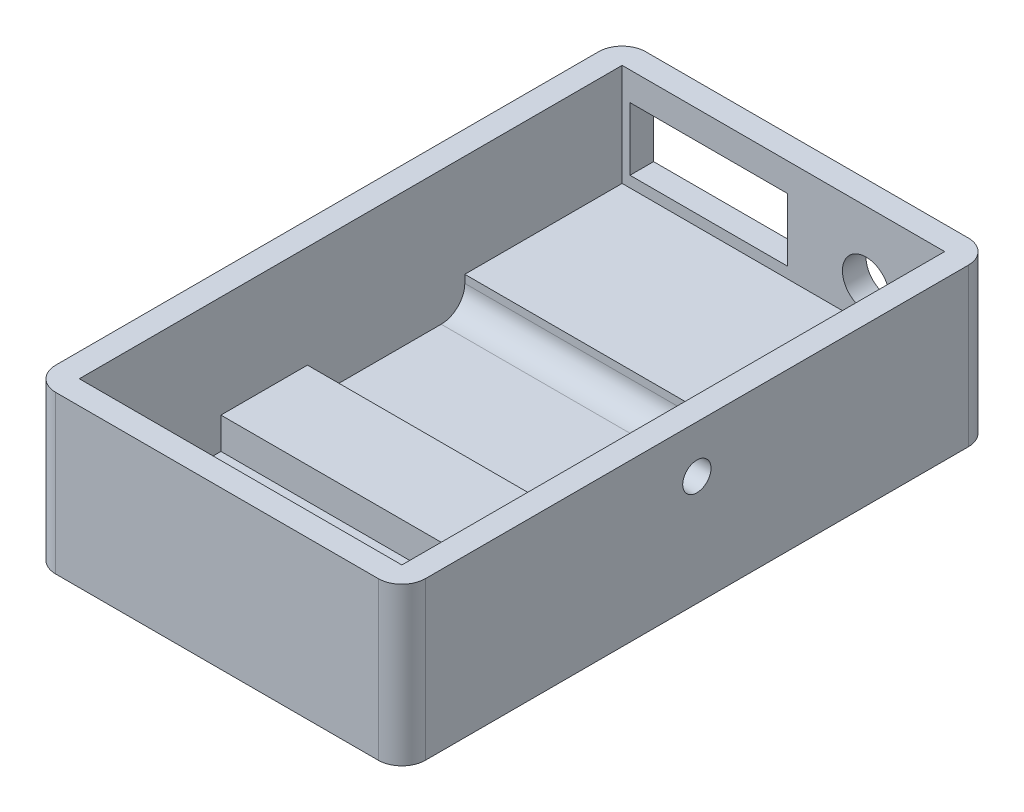
ISO-10303-21;
HEADER;
FILE_DESCRIPTION(('STEP AP214'),'2;1');
FILE_NAME('part.step','',(''),(''),'','','');
FILE_SCHEMA(('AUTOMOTIVE_DESIGN { 1 0 10303 214 1 1 1 1 }'));
ENDSEC;
DATA;
#1=APPLICATION_CONTEXT('core data for automotive mechanical design processes');
#2=APPLICATION_PROTOCOL_DEFINITION('international standard','automotive_design',2000,#1);
#3=PRODUCT_CONTEXT('',#1,'mechanical');
#4=PRODUCT('Part','Part','',(#3));
#5=PRODUCT_RELATED_PRODUCT_CATEGORY('part','',(#4));
#6=PRODUCT_DEFINITION_FORMATION('','',#4);
#7=PRODUCT_DEFINITION_CONTEXT('part definition',#1,'design');
#8=PRODUCT_DEFINITION('design','',#6,#7);
#9=PRODUCT_DEFINITION_SHAPE('','',#8);
#10=(LENGTH_UNIT() NAMED_UNIT(*) SI_UNIT(.MILLI.,.METRE.));
#11=(NAMED_UNIT(*) PLANE_ANGLE_UNIT() SI_UNIT($,.RADIAN.));
#12=(NAMED_UNIT(*) SI_UNIT($,.STERADIAN.) SOLID_ANGLE_UNIT());
#13=UNCERTAINTY_MEASURE_WITH_UNIT(LENGTH_MEASURE(1.E-05),#10,'distance_accuracy_value','');
#14=(GEOMETRIC_REPRESENTATION_CONTEXT(3) GLOBAL_UNCERTAINTY_ASSIGNED_CONTEXT((#13)) GLOBAL_UNIT_ASSIGNED_CONTEXT((#10,
#11,#12)) REPRESENTATION_CONTEXT('',''));
#15=CARTESIAN_POINT('',(0.,0.,0.));
#16=DIRECTION('',(0.,0.,1.));
#17=DIRECTION('',(1.,0.,0.));
#18=AXIS2_PLACEMENT_3D('',#15,#16,#17);
#19=CARTESIAN_POINT('',(0.,3.5,0.));
#20=DIRECTION('',(0.,1.,0.));
#21=DIRECTION('',(0.,0.,1.));
#22=AXIS2_PLACEMENT_3D('',#19,#20,#21);
#23=PLANE('',#22);
#24=CARTESIAN_POINT('',(7.85,3.5,-10.85));
#25=DIRECTION('',(0.,1.,0.));
#26=DIRECTION('',(0.,0.,1.));
#27=AXIS2_PLACEMENT_3D('',#24,#25,#26);
#28=CIRCLE('',#27,0.9);
#29=CARTESIAN_POINT('',(7.85,3.5,-9.95));
#30=VERTEX_POINT('',#29);
#31=EDGE_CURVE('E463',#30,#30,#28,.T.);
#32=ORIENTED_EDGE('',*,*,#31,.F.);
#33=EDGE_LOOP('',(#32));
#34=FACE_BOUND('',#33,.T.);
#35=DIRECTION('',(-1.,0.,0.));
#36=VECTOR('',#35,1.);
#37=CARTESIAN_POINT('',(-10.25,3.5,-7.25));
#38=LINE('',#37,#36);
#39=CARTESIAN_POINT('',(10.25,3.5,-7.25));
#40=VERTEX_POINT('',#39);
#41=CARTESIAN_POINT('',(-10.25,3.5,-7.25));
#42=VERTEX_POINT('',#41);
#43=EDGE_CURVE('E242',#40,#42,#38,.T.);
#44=ORIENTED_EDGE('',*,*,#43,.F.);
#45=DIRECTION('',(0.,0.,-1.));
#46=VECTOR('',#45,1.);
#47=CARTESIAN_POINT('',(10.25,3.5,-17.25));
#48=LINE('',#47,#46);
#49=CARTESIAN_POINT('',(10.25,3.5,-17.25));
#50=VERTEX_POINT('',#49);
#51=EDGE_CURVE('E273',#40,#50,#48,.T.);
#52=ORIENTED_EDGE('',*,*,#51,.T.);
#53=DIRECTION('',(-1.,0.,0.));
#54=VECTOR('',#53,1.);
#55=CARTESIAN_POINT('',(-10.25,3.5,-17.25));
#56=LINE('',#55,#54);
#57=CARTESIAN_POINT('',(-10.25,3.5,-17.25));
#58=VERTEX_POINT('',#57);
#59=EDGE_CURVE('E278',#50,#58,#56,.T.);
#60=ORIENTED_EDGE('',*,*,#59,.T.);
#61=DIRECTION('',(0.,0.,1.));
#62=VECTOR('',#61,1.);
#63=CARTESIAN_POINT('',(-10.25,3.5,-17.25));
#64=LINE('',#63,#62);
#65=EDGE_CURVE('E265',#58,#42,#64,.T.);
#66=ORIENTED_EDGE('',*,*,#65,.T.);
#67=EDGE_LOOP('',(#44,#52,#60,#66));
#68=FACE_BOUND('',#67,.T.);
#69=ADVANCED_FACE('F39',(#34,#68),#23,.T.);
#70=CARTESIAN_POINT('',(-10.25,10.,-18.75));
#71=DIRECTION('',(1.,0.,0.));
#72=DIRECTION('',(0.,0.,-1.));
#73=AXIS2_PLACEMENT_3D('',#70,#71,#72);
#74=PLANE('',#73);
#75=DIRECTION('',(0.,1.,0.));
#76=VECTOR('',#75,1.);
#77=CARTESIAN_POINT('',(-10.25,1.5,2.75));
#78=LINE('',#77,#76);
#79=CARTESIAN_POINT('',(-10.25,3.,2.75));
#80=VERTEX_POINT('',#79);
#81=CARTESIAN_POINT('',(-10.25,3.5,2.75));
#82=VERTEX_POINT('',#81);
#83=EDGE_CURVE('E246',#80,#82,#78,.T.);
#84=ORIENTED_EDGE('',*,*,#83,.F.);
#85=CARTESIAN_POINT('',(-10.25,3.,1.25));
#86=DIRECTION('',(1.,0.,0.));
#87=DIRECTION('',(0.,0.,-1.));
#88=AXIS2_PLACEMENT_3D('',#85,#86,#87);
#89=CIRCLE('',#88,1.5);
#90=CARTESIAN_POINT('',(-10.25,1.5,1.25));
#91=VERTEX_POINT('',#90);
#92=EDGE_CURVE('E433',#80,#91,#89,.T.);
#93=ORIENTED_EDGE('',*,*,#92,.T.);
#94=DIRECTION('',(0.,0.,1.));
#95=VECTOR('',#94,1.);
#96=CARTESIAN_POINT('',(-10.25,1.5,-7.25));
#97=LINE('',#96,#95);
#98=CARTESIAN_POINT('',(-10.25,1.5,-5.75));
#99=VERTEX_POINT('',#98);
#100=EDGE_CURVE('E237',#99,#91,#97,.T.);
#101=ORIENTED_EDGE('',*,*,#100,.F.);
#102=CARTESIAN_POINT('',(-10.25,3.,-5.75));
#103=DIRECTION('',(1.,0.,0.));
#104=DIRECTION('',(0.,0.,-1.));
#105=AXIS2_PLACEMENT_3D('',#102,#103,#104);
#106=CIRCLE('',#105,1.5);
#107=CARTESIAN_POINT('',(-10.25,3.,-7.25));
#108=VERTEX_POINT('',#107);
#109=EDGE_CURVE('E430',#99,#108,#106,.T.);
#110=ORIENTED_EDGE('',*,*,#109,.T.);
#111=DIRECTION('',(0.,1.,0.));
#112=VECTOR('',#111,1.);
#113=CARTESIAN_POINT('',(-10.25,1.5,-7.25));
#114=LINE('',#113,#112);
#115=EDGE_CURVE('E253',#108,#42,#114,.T.);
#116=ORIENTED_EDGE('',*,*,#115,.T.);
#117=ORIENTED_EDGE('',*,*,#65,.F.);
#118=DIRECTION('',(0.,-1.,0.));
#119=VECTOR('',#118,1.);
#120=CARTESIAN_POINT('',(-10.25,10.,-17.25));
#121=LINE('',#120,#119);
#122=CARTESIAN_POINT('',(-10.25,10.,-17.25));
#123=VERTEX_POINT('',#122);
#124=EDGE_CURVE('E300',#123,#58,#121,.T.);
#125=ORIENTED_EDGE('',*,*,#124,.F.);
#126=DIRECTION('',(0.,0.,1.));
#127=VECTOR('',#126,1.);
#128=CARTESIAN_POINT('',(-10.25,10.,-18.75));
#129=LINE('',#128,#127);
#130=CARTESIAN_POINT('',(-10.25,10.,17.25));
#131=VERTEX_POINT('',#130);
#132=EDGE_CURVE('E315',#123,#131,#129,.T.);
#133=ORIENTED_EDGE('',*,*,#132,.T.);
#134=DIRECTION('',(0.,-1.,0.));
#135=VECTOR('',#134,1.);
#136=CARTESIAN_POINT('',(-10.25,10.,17.25));
#137=LINE('',#136,#135);
#138=CARTESIAN_POINT('',(-10.25,1.5,17.25));
#139=VERTEX_POINT('',#138);
#140=EDGE_CURVE('E294',#131,#139,#137,.T.);
#141=ORIENTED_EDGE('',*,*,#140,.T.);
#142=DIRECTION('',(0.,0.,1.));
#143=VECTOR('',#142,1.);
#144=CARTESIAN_POINT('',(-10.25,1.5,-18.75));
#145=LINE('',#144,#143);
#146=CARTESIAN_POINT('',(-10.25,1.5,8.25));
#147=VERTEX_POINT('',#146);
#148=EDGE_CURVE('E290',#147,#139,#145,.T.);
#149=ORIENTED_EDGE('',*,*,#148,.F.);
#150=DIRECTION('',(0.,-1.,0.));
#151=VECTOR('',#150,1.);
#152=CARTESIAN_POINT('',(-10.25,3.5,8.25));
#153=LINE('',#152,#151);
#154=CARTESIAN_POINT('',(-10.25,3.5,8.25));
#155=VERTEX_POINT('',#154);
#156=EDGE_CURVE('E287',#155,#147,#153,.T.);
#157=ORIENTED_EDGE('',*,*,#156,.F.);
#158=EDGE_CURVE('E270',#82,#155,#64,.T.);
#159=ORIENTED_EDGE('',*,*,#158,.F.);
#160=EDGE_LOOP('',(#84,#93,#101,#110,#116,#117,#125,#133,#141,#149,#157,#159));
#161=FACE_BOUND('',#160,.T.);
#162=ADVANCED_FACE('F534',(#161),#74,.T.);
#163=CARTESIAN_POINT('',(10.25,10.,-18.75));
#164=DIRECTION('',(-1.,0.,0.));
#165=DIRECTION('',(0.,0.,1.));
#166=AXIS2_PLACEMENT_3D('',#163,#164,#165);
#167=PLANE('',#166);
#168=CARTESIAN_POINT('',(10.25,7.,0.));
#169=DIRECTION('',(-1.,0.,0.));
#170=DIRECTION('',(0.,0.,1.));
#171=AXIS2_PLACEMENT_3D('',#168,#169,#170);
#172=CIRCLE('',#171,0.9);
#173=CARTESIAN_POINT('',(10.25,7.,0.899999999999999));
#174=VERTEX_POINT('',#173);
#175=EDGE_CURVE('E467',#174,#174,#172,.T.);
#176=ORIENTED_EDGE('',*,*,#175,.F.);
#177=EDGE_LOOP('',(#176));
#178=FACE_BOUND('',#177,.T.);
#179=DIRECTION('',(0.,0.,-1.));
#180=VECTOR('',#179,1.);
#181=CARTESIAN_POINT('',(10.25,1.5,-7.25));
#182=LINE('',#181,#180);
#183=CARTESIAN_POINT('',(10.25,1.5,1.25));
#184=VERTEX_POINT('',#183);
#185=CARTESIAN_POINT('',(10.25,1.5,-5.75));
#186=VERTEX_POINT('',#185);
#187=EDGE_CURVE('E241',#184,#186,#182,.T.);
#188=ORIENTED_EDGE('',*,*,#187,.F.);
#189=CARTESIAN_POINT('',(10.25,3.,1.25));
#190=DIRECTION('',(-1.,0.,0.));
#191=DIRECTION('',(0.,0.,1.));
#192=AXIS2_PLACEMENT_3D('',#189,#190,#191);
#193=CIRCLE('',#192,1.5);
#194=CARTESIAN_POINT('',(10.25,3.,2.75));
#195=VERTEX_POINT('',#194);
#196=EDGE_CURVE('E424',#184,#195,#193,.T.);
#197=ORIENTED_EDGE('',*,*,#196,.T.);
#198=DIRECTION('',(0.,1.,0.));
#199=VECTOR('',#198,1.);
#200=CARTESIAN_POINT('',(10.25,1.5,2.75));
#201=LINE('',#200,#199);
#202=CARTESIAN_POINT('',(10.25,3.5,2.75));
#203=VERTEX_POINT('',#202);
#204=EDGE_CURVE('E260',#195,#203,#201,.T.);
#205=ORIENTED_EDGE('',*,*,#204,.T.);
#206=CARTESIAN_POINT('',(10.25,3.5,8.25));
#207=VERTEX_POINT('',#206);
#208=EDGE_CURVE('E274',#207,#203,#48,.T.);
#209=ORIENTED_EDGE('',*,*,#208,.F.);
#210=DIRECTION('',(0.,-1.,0.));
#211=VECTOR('',#210,1.);
#212=CARTESIAN_POINT('',(10.25,3.5,8.25));
#213=LINE('',#212,#211);
#214=CARTESIAN_POINT('',(10.25,1.5,8.25));
#215=VERTEX_POINT('',#214);
#216=EDGE_CURVE('E281',#207,#215,#213,.T.);
#217=ORIENTED_EDGE('',*,*,#216,.T.);
#218=DIRECTION('',(0.,0.,-1.));
#219=VECTOR('',#218,1.);
#220=CARTESIAN_POINT('',(10.25,1.5,-18.75));
#221=LINE('',#220,#219);
#222=CARTESIAN_POINT('',(10.25,1.5,17.25));
#223=VERTEX_POINT('',#222);
#224=EDGE_CURVE('E308',#223,#215,#221,.T.);
#225=ORIENTED_EDGE('',*,*,#224,.F.);
#226=DIRECTION('',(0.,-1.,0.));
#227=VECTOR('',#226,1.);
#228=CARTESIAN_POINT('',(10.25,10.,17.25));
#229=LINE('',#228,#227);
#230=CARTESIAN_POINT('',(10.25,10.,17.25));
#231=VERTEX_POINT('',#230);
#232=EDGE_CURVE('E299',#231,#223,#229,.T.);
#233=ORIENTED_EDGE('',*,*,#232,.F.);
#234=DIRECTION('',(0.,0.,-1.));
#235=VECTOR('',#234,1.);
#236=CARTESIAN_POINT('',(10.25,10.,-18.75));
#237=LINE('',#236,#235);
#238=CARTESIAN_POINT('',(10.25,10.,-17.25));
#239=VERTEX_POINT('',#238);
#240=EDGE_CURVE('E324',#231,#239,#237,.T.);
#241=ORIENTED_EDGE('',*,*,#240,.T.);
#242=DIRECTION('',(0.,-1.,0.));
#243=VECTOR('',#242,1.);
#244=CARTESIAN_POINT('',(10.25,10.,-17.25));
#245=LINE('',#244,#243);
#246=EDGE_CURVE('E304',#239,#50,#245,.T.);
#247=ORIENTED_EDGE('',*,*,#246,.T.);
#248=ORIENTED_EDGE('',*,*,#51,.F.);
#249=DIRECTION('',(0.,1.,0.));
#250=VECTOR('',#249,1.);
#251=CARTESIAN_POINT('',(10.25,1.5,-7.25));
#252=LINE('',#251,#250);
#253=CARTESIAN_POINT('',(10.25,3.,-7.25));
#254=VERTEX_POINT('',#253);
#255=EDGE_CURVE('E257',#254,#40,#252,.T.);
#256=ORIENTED_EDGE('',*,*,#255,.F.);
#257=CARTESIAN_POINT('',(10.25,3.,-5.75));
#258=DIRECTION('',(-1.,0.,0.));
#259=DIRECTION('',(0.,0.,1.));
#260=AXIS2_PLACEMENT_3D('',#257,#258,#259);
#261=CIRCLE('',#260,1.5);
#262=EDGE_CURVE('E421',#254,#186,#261,.T.);
#263=ORIENTED_EDGE('',*,*,#262,.T.);
#264=EDGE_LOOP('',(#188,#197,#205,#209,#217,#225,#233,#241,#247,#248,#256,#263));
#265=FACE_BOUND('',#264,.T.);
#266=ADVANCED_FACE('F541',(#178,#265),#167,.T.);
#267=CARTESIAN_POINT('',(0.,1.5,0.));
#268=DIRECTION('',(0.,1.,0.));
#269=DIRECTION('',(0.,0.,1.));
#270=AXIS2_PLACEMENT_3D('',#267,#268,#269);
#271=PLANE('',#270);
#272=ORIENTED_EDGE('',*,*,#224,.T.);
#273=DIRECTION('',(1.,0.,0.));
#274=VECTOR('',#273,1.);
#275=CARTESIAN_POINT('',(-10.25,1.5,8.25));
#276=LINE('',#275,#274);
#277=EDGE_CURVE('E256',#147,#215,#276,.T.);
#278=ORIENTED_EDGE('',*,*,#277,.F.);
#279=ORIENTED_EDGE('',*,*,#148,.T.);
#280=DIRECTION('',(1.,0.,0.));
#281=VECTOR('',#280,1.);
#282=CARTESIAN_POINT('',(-11.75,1.5,17.25));
#283=LINE('',#282,#281);
#284=EDGE_CURVE('E293',#139,#223,#283,.T.);
#285=ORIENTED_EDGE('',*,*,#284,.T.);
#286=EDGE_LOOP('',(#272,#278,#279,#285));
#287=FACE_BOUND('',#286,.T.);
#288=ADVANCED_FACE('F632',(#287),#271,.T.);
#289=CARTESIAN_POINT('',(-11.75,10.,-18.75));
#290=DIRECTION('',(1.,0.,0.));
#291=DIRECTION('',(0.,0.,-1.));
#292=AXIS2_PLACEMENT_3D('',#289,#290,#291);
#293=PLANE('',#292);
#294=DIRECTION('',(0.,0.,1.));
#295=VECTOR('',#294,1.);
#296=CARTESIAN_POINT('',(-11.75,0.,-18.75));
#297=LINE('',#296,#295);
#298=CARTESIAN_POINT('',(-11.75,0.,-17.25));
#299=VERTEX_POINT('',#298);
#300=CARTESIAN_POINT('',(-11.75,0.,17.25));
#301=VERTEX_POINT('',#300);
#302=EDGE_CURVE('E298',#299,#301,#297,.T.);
#303=ORIENTED_EDGE('',*,*,#302,.T.);
#304=DIRECTION('',(0.,-1.,0.));
#305=VECTOR('',#304,1.);
#306=CARTESIAN_POINT('',(-11.75,10.,17.25));
#307=LINE('',#306,#305);
#308=CARTESIAN_POINT('',(-11.75,10.,17.25));
#309=VERTEX_POINT('',#308);
#310=EDGE_CURVE('E410',#301,#309,#307,.F.);
#311=ORIENTED_EDGE('',*,*,#310,.T.);
#312=DIRECTION('',(0.,0.,1.));
#313=VECTOR('',#312,1.);
#314=CARTESIAN_POINT('',(-11.75,10.,-18.75));
#315=LINE('',#314,#313);
#316=CARTESIAN_POINT('',(-11.75,10.,-17.25));
#317=VERTEX_POINT('',#316);
#318=EDGE_CURVE('E330',#317,#309,#315,.T.);
#319=ORIENTED_EDGE('',*,*,#318,.F.);
#320=DIRECTION('',(0.,-1.,0.));
#321=VECTOR('',#320,1.);
#322=CARTESIAN_POINT('',(-11.75,10.,-17.25));
#323=LINE('',#322,#321);
#324=EDGE_CURVE('E406',#317,#299,#323,.T.);
#325=ORIENTED_EDGE('',*,*,#324,.T.);
#326=EDGE_LOOP('',(#303,#311,#319,#325));
#327=FACE_BOUND('',#326,.T.);
#328=ADVANCED_FACE('F507',(#327),#293,.F.);
#329=CARTESIAN_POINT('',(-11.75,10.,18.75));
#330=DIRECTION('',(0.,0.,-1.));
#331=DIRECTION('',(-1.,0.,0.));
#332=AXIS2_PLACEMENT_3D('',#329,#330,#331);
#333=PLANE('',#332);
#334=DIRECTION('',(1.,0.,0.));
#335=VECTOR('',#334,1.);
#336=CARTESIAN_POINT('',(-11.75,0.,18.75));
#337=LINE('',#336,#335);
#338=CARTESIAN_POINT('',(-10.25,0.,18.75));
#339=VERTEX_POINT('',#338);
#340=CARTESIAN_POINT('',(10.25,0.,18.75));
#341=VERTEX_POINT('',#340);
#342=EDGE_CURVE('E351',#339,#341,#337,.T.);
#343=ORIENTED_EDGE('',*,*,#342,.T.);
#344=DIRECTION('',(0.,-1.,0.));
#345=VECTOR('',#344,1.);
#346=CARTESIAN_POINT('',(10.25,10.,18.75));
#347=LINE('',#346,#345);
#348=CARTESIAN_POINT('',(10.25,10.,18.75));
#349=VERTEX_POINT('',#348);
#350=EDGE_CURVE('E403',#341,#349,#347,.F.);
#351=ORIENTED_EDGE('',*,*,#350,.T.);
#352=DIRECTION('',(1.,0.,0.));
#353=VECTOR('',#352,1.);
#354=CARTESIAN_POINT('',(-11.75,10.,18.75));
#355=LINE('',#354,#353);
#356=CARTESIAN_POINT('',(-10.25,10.,18.75));
#357=VERTEX_POINT('',#356);
#358=EDGE_CURVE('E334',#357,#349,#355,.T.);
#359=ORIENTED_EDGE('',*,*,#358,.F.);
#360=DIRECTION('',(0.,-1.,0.));
#361=VECTOR('',#360,1.);
#362=CARTESIAN_POINT('',(-10.25,10.,18.75));
#363=LINE('',#362,#361);
#364=EDGE_CURVE('E399',#357,#339,#363,.T.);
#365=ORIENTED_EDGE('',*,*,#364,.T.);
#366=EDGE_LOOP('',(#343,#351,#359,#365));
#367=FACE_BOUND('',#366,.T.);
#368=ADVANCED_FACE('F484',(#367),#333,.F.);
#369=CARTESIAN_POINT('',(11.75,10.,-18.75));
#370=DIRECTION('',(-1.,0.,0.));
#371=DIRECTION('',(0.,0.,1.));
#372=AXIS2_PLACEMENT_3D('',#369,#370,#371);
#373=PLANE('',#372);
#374=CARTESIAN_POINT('',(11.75,7.,0.));
#375=DIRECTION('',(1.,0.,0.));
#376=DIRECTION('',(0.,0.,-1.));
#377=AXIS2_PLACEMENT_3D('',#374,#375,#376);
#378=CIRCLE('',#377,0.9);
#379=CARTESIAN_POINT('',(11.75,7.,-0.900000000000001));
#380=VERTEX_POINT('',#379);
#381=EDGE_CURVE('E474',#380,#380,#378,.T.);
#382=ORIENTED_EDGE('',*,*,#381,.F.);
#383=EDGE_LOOP('',(#382));
#384=FACE_BOUND('',#383,.T.);
#385=DIRECTION('',(0.,0.,-1.));
#386=VECTOR('',#385,1.);
#387=CARTESIAN_POINT('',(11.75,0.,-18.75));
#388=LINE('',#387,#386);
#389=CARTESIAN_POINT('',(11.75,0.,17.25));
#390=VERTEX_POINT('',#389);
#391=CARTESIAN_POINT('',(11.75,0.,-17.25));
#392=VERTEX_POINT('',#391);
#393=EDGE_CURVE('E355',#390,#392,#388,.T.);
#394=ORIENTED_EDGE('',*,*,#393,.T.);
#395=DIRECTION('',(0.,-1.,0.));
#396=VECTOR('',#395,1.);
#397=CARTESIAN_POINT('',(11.75,10.,-17.25));
#398=LINE('',#397,#396);
#399=CARTESIAN_POINT('',(11.75,10.,-17.25));
#400=VERTEX_POINT('',#399);
#401=EDGE_CURVE('E384',#392,#400,#398,.F.);
#402=ORIENTED_EDGE('',*,*,#401,.T.);
#403=DIRECTION('',(0.,0.,-1.));
#404=VECTOR('',#403,1.);
#405=CARTESIAN_POINT('',(11.75,10.,-18.75));
#406=LINE('',#405,#404);
#407=CARTESIAN_POINT('',(11.75,10.,17.25));
#408=VERTEX_POINT('',#407);
#409=EDGE_CURVE('E339',#408,#400,#406,.T.);
#410=ORIENTED_EDGE('',*,*,#409,.F.);
#411=DIRECTION('',(0.,-1.,0.));
#412=VECTOR('',#411,1.);
#413=CARTESIAN_POINT('',(11.75,10.,17.25));
#414=LINE('',#413,#412);
#415=EDGE_CURVE('E380',#408,#390,#414,.T.);
#416=ORIENTED_EDGE('',*,*,#415,.T.);
#417=EDGE_LOOP('',(#394,#402,#410,#416));
#418=FACE_BOUND('',#417,.T.);
#419=ADVANCED_FACE('F481',(#384,#418),#373,.F.);
#420=CARTESIAN_POINT('',(-11.75,10.,-18.75));
#421=DIRECTION('',(0.,0.,1.));
#422=DIRECTION('',(1.,0.,0.));
#423=AXIS2_PLACEMENT_3D('',#420,#421,#422);
#424=PLANE('',#423);
#425=CARTESIAN_POINT('',(5.25,5.7,-18.75));
#426=DIRECTION('',(0.,0.,-1.));
#427=DIRECTION('',(-1.,0.,0.));
#428=AXIS2_PLACEMENT_3D('',#425,#426,#427);
#429=CIRCLE('',#428,1.5);
#430=CARTESIAN_POINT('',(3.75,5.7,-18.75));
#431=VERTEX_POINT('',#430);
#432=EDGE_CURVE('E457',#431,#431,#429,.T.);
#433=ORIENTED_EDGE('',*,*,#432,.F.);
#434=EDGE_LOOP('',(#433));
#435=FACE_BOUND('',#434,.T.);
#436=DIRECTION('',(-1.,0.,0.));
#437=VECTOR('',#436,1.);
#438=CARTESIAN_POINT('',(0.249999999999998,4.2,-18.75));
#439=LINE('',#438,#437);
#440=CARTESIAN_POINT('',(0.249999999999999,4.2,-18.75));
#441=VERTEX_POINT('',#440);
#442=CARTESIAN_POINT('',(-9.75,4.2,-18.75));
#443=VERTEX_POINT('',#442);
#444=EDGE_CURVE('E214',#441,#443,#439,.T.);
#445=ORIENTED_EDGE('',*,*,#444,.F.);
#446=DIRECTION('',(0.,-1.,0.));
#447=VECTOR('',#446,1.);
#448=CARTESIAN_POINT('',(0.249999999999999,8.2,-18.75));
#449=LINE('',#448,#447);
#450=CARTESIAN_POINT('',(0.249999999999999,8.2,-18.75));
#451=VERTEX_POINT('',#450);
#452=EDGE_CURVE('E56',#451,#441,#449,.T.);
#453=ORIENTED_EDGE('',*,*,#452,.F.);
#454=DIRECTION('',(1.,0.,0.));
#455=VECTOR('',#454,1.);
#456=CARTESIAN_POINT('',(0.249999999999999,8.2,-18.75));
#457=LINE('',#456,#455);
#458=CARTESIAN_POINT('',(-9.75,8.2,-18.75));
#459=VERTEX_POINT('',#458);
#460=EDGE_CURVE('E222',#459,#451,#457,.T.);
#461=ORIENTED_EDGE('',*,*,#460,.F.);
#462=DIRECTION('',(0.,1.,0.));
#463=VECTOR('',#462,1.);
#464=CARTESIAN_POINT('',(-9.75,8.2,-18.75));
#465=LINE('',#464,#463);
#466=EDGE_CURVE('E204',#443,#459,#465,.T.);
#467=ORIENTED_EDGE('',*,*,#466,.F.);
#468=EDGE_LOOP('',(#445,#453,#461,#467));
#469=FACE_BOUND('',#468,.T.);
#470=DIRECTION('',(-1.,0.,0.));
#471=VECTOR('',#470,1.);
#472=CARTESIAN_POINT('',(-11.75,10.,-18.75));
#473=LINE('',#472,#471);
#474=CARTESIAN_POINT('',(10.25,10.,-18.75));
#475=VERTEX_POINT('',#474);
#476=CARTESIAN_POINT('',(-10.25,10.,-18.75));
#477=VERTEX_POINT('',#476);
#478=EDGE_CURVE('E343',#475,#477,#473,.T.);
#479=ORIENTED_EDGE('',*,*,#478,.F.);
#480=DIRECTION('',(0.,-1.,0.));
#481=VECTOR('',#480,1.);
#482=CARTESIAN_POINT('',(10.25,10.,-18.75));
#483=LINE('',#482,#481);
#484=CARTESIAN_POINT('',(10.25,0.,-18.75));
#485=VERTEX_POINT('',#484);
#486=EDGE_CURVE('E364',#475,#485,#483,.T.);
#487=ORIENTED_EDGE('',*,*,#486,.T.);
#488=DIRECTION('',(-1.,0.,0.));
#489=VECTOR('',#488,1.);
#490=CARTESIAN_POINT('',(-11.75,0.,-18.75));
#491=LINE('',#490,#489);
#492=CARTESIAN_POINT('',(-10.25,0.,-18.75));
#493=VERTEX_POINT('',#492);
#494=EDGE_CURVE('E335',#485,#493,#491,.T.);
#495=ORIENTED_EDGE('',*,*,#494,.T.);
#496=DIRECTION('',(0.,-1.,0.));
#497=VECTOR('',#496,1.);
#498=CARTESIAN_POINT('',(-10.25,10.,-18.75));
#499=LINE('',#498,#497);
#500=EDGE_CURVE('E347',#493,#477,#499,.F.);
#501=ORIENTED_EDGE('',*,*,#500,.T.);
#502=EDGE_LOOP('',(#479,#487,#495,#501));
#503=FACE_BOUND('',#502,.T.);
#504=ADVANCED_FACE('F219',(#435,#469,#503),#424,.F.);
#505=CARTESIAN_POINT('',(0.,10.,0.));
#506=DIRECTION('',(0.,1.,0.));
#507=DIRECTION('',(0.,0.,1.));
#508=AXIS2_PLACEMENT_3D('',#505,#506,#507);
#509=PLANE('',#508);
#510=ORIENTED_EDGE('',*,*,#132,.F.);
#511=DIRECTION('',(-1.,0.,0.));
#512=VECTOR('',#511,1.);
#513=CARTESIAN_POINT('',(-11.75,10.,-17.25));
#514=LINE('',#513,#512);
#515=EDGE_CURVE('E305',#239,#123,#514,.T.);
#516=ORIENTED_EDGE('',*,*,#515,.F.);
#517=ORIENTED_EDGE('',*,*,#240,.F.);
#518=DIRECTION('',(1.,0.,0.));
#519=VECTOR('',#518,1.);
#520=CARTESIAN_POINT('',(-11.75,10.,17.25));
#521=LINE('',#520,#519);
#522=EDGE_CURVE('E321',#131,#231,#521,.T.);
#523=ORIENTED_EDGE('',*,*,#522,.F.);
#524=EDGE_LOOP('',(#510,#516,#517,#523));
#525=FACE_BOUND('',#524,.T.);
#526=ORIENTED_EDGE('',*,*,#409,.T.);
#527=CARTESIAN_POINT('',(10.25,10.,-17.25));
#528=DIRECTION('',(0.,1.,0.));
#529=DIRECTION('',(0.,0.,1.));
#530=AXIS2_PLACEMENT_3D('',#527,#528,#529);
#531=CIRCLE('',#530,1.5);
#532=EDGE_CURVE('E396',#400,#475,#531,.T.);
#533=ORIENTED_EDGE('',*,*,#532,.T.);
#534=ORIENTED_EDGE('',*,*,#478,.T.);
#535=CARTESIAN_POINT('',(-10.25,10.,-17.25));
#536=DIRECTION('',(0.,1.,0.));
#537=DIRECTION('',(0.,0.,1.));
#538=AXIS2_PLACEMENT_3D('',#535,#536,#537);
#539=CIRCLE('',#538,1.5);
#540=EDGE_CURVE('E387',#477,#317,#539,.T.);
#541=ORIENTED_EDGE('',*,*,#540,.T.);
#542=ORIENTED_EDGE('',*,*,#318,.T.);
#543=CARTESIAN_POINT('',(-10.25,10.,17.25));
#544=DIRECTION('',(0.,1.,0.));
#545=DIRECTION('',(0.,0.,1.));
#546=AXIS2_PLACEMENT_3D('',#543,#544,#545);
#547=CIRCLE('',#546,1.5);
#548=EDGE_CURVE('E390',#309,#357,#547,.T.);
#549=ORIENTED_EDGE('',*,*,#548,.T.);
#550=ORIENTED_EDGE('',*,*,#358,.T.);
#551=CARTESIAN_POINT('',(10.25,10.,17.25));
#552=DIRECTION('',(0.,1.,0.));
#553=DIRECTION('',(0.,0.,1.));
#554=AXIS2_PLACEMENT_3D('',#551,#552,#553);
#555=CIRCLE('',#554,1.5);
#556=EDGE_CURVE('E393',#349,#408,#555,.T.);
#557=ORIENTED_EDGE('',*,*,#556,.T.);
#558=EDGE_LOOP('',(#526,#533,#534,#541,#542,#549,#550,#557));
#559=FACE_BOUND('',#558,.T.);
#560=ADVANCED_FACE('F497',(#525,#559),#509,.T.);
#561=CARTESIAN_POINT('',(0.,0.,0.));
#562=DIRECTION('',(0.,1.,0.));
#563=DIRECTION('',(0.,0.,1.));
#564=AXIS2_PLACEMENT_3D('',#561,#562,#563);
#565=PLANE('',#564);
#566=ORIENTED_EDGE('',*,*,#494,.F.);
#567=CARTESIAN_POINT('',(10.25,0.,-17.25));
#568=DIRECTION('',(0.,1.,0.));
#569=DIRECTION('',(0.,0.,1.));
#570=AXIS2_PLACEMENT_3D('',#567,#568,#569);
#571=CIRCLE('',#570,1.5);
#572=EDGE_CURVE('E377',#485,#392,#571,.F.);
#573=ORIENTED_EDGE('',*,*,#572,.T.);
#574=ORIENTED_EDGE('',*,*,#393,.F.);
#575=CARTESIAN_POINT('',(10.25,0.,17.25));
#576=DIRECTION('',(0.,1.,0.));
#577=DIRECTION('',(0.,0.,1.));
#578=AXIS2_PLACEMENT_3D('',#575,#576,#577);
#579=CIRCLE('',#578,1.5);
#580=EDGE_CURVE('E374',#390,#341,#579,.F.);
#581=ORIENTED_EDGE('',*,*,#580,.T.);
#582=ORIENTED_EDGE('',*,*,#342,.F.);
#583=CARTESIAN_POINT('',(-10.25,0.,17.25));
#584=DIRECTION('',(0.,1.,0.));
#585=DIRECTION('',(0.,0.,1.));
#586=AXIS2_PLACEMENT_3D('',#583,#584,#585);
#587=CIRCLE('',#586,1.5);
#588=EDGE_CURVE('E371',#339,#301,#587,.F.);
#589=ORIENTED_EDGE('',*,*,#588,.T.);
#590=ORIENTED_EDGE('',*,*,#302,.F.);
#591=CARTESIAN_POINT('',(-10.25,0.,-17.25));
#592=DIRECTION('',(0.,1.,0.));
#593=DIRECTION('',(0.,0.,1.));
#594=AXIS2_PLACEMENT_3D('',#591,#592,#593);
#595=CIRCLE('',#594,1.5);
#596=EDGE_CURVE('E368',#299,#493,#595,.F.);
#597=ORIENTED_EDGE('',*,*,#596,.T.);
#598=EDGE_LOOP('',(#566,#573,#574,#581,#582,#589,#590,#597));
#599=FACE_BOUND('',#598,.T.);
#600=ADVANCED_FACE('F520',(#599),#565,.F.);
#601=CARTESIAN_POINT('',(-11.75,10.,17.25));
#602=DIRECTION('',(0.,0.,-1.));
#603=DIRECTION('',(-1.,0.,0.));
#604=AXIS2_PLACEMENT_3D('',#601,#602,#603);
#605=PLANE('',#604);
#606=ORIENTED_EDGE('',*,*,#284,.F.);
#607=ORIENTED_EDGE('',*,*,#140,.F.);
#608=ORIENTED_EDGE('',*,*,#522,.T.);
#609=ORIENTED_EDGE('',*,*,#232,.T.);
#610=EDGE_LOOP('',(#606,#607,#608,#609));
#611=FACE_BOUND('',#610,.T.);
#612=ADVANCED_FACE('F522',(#611),#605,.T.);
#613=CARTESIAN_POINT('',(-11.75,10.,-17.25));
#614=DIRECTION('',(0.,0.,1.));
#615=DIRECTION('',(1.,0.,0.));
#616=AXIS2_PLACEMENT_3D('',#613,#614,#615);
#617=PLANE('',#616);
#618=CARTESIAN_POINT('',(5.25,5.7,-17.25));
#619=DIRECTION('',(0.,0.,1.));
#620=DIRECTION('',(1.,0.,0.));
#621=AXIS2_PLACEMENT_3D('',#618,#619,#620);
#622=CIRCLE('',#621,1.5);
#623=CARTESIAN_POINT('',(6.75,5.7,-17.25));
#624=VERTEX_POINT('',#623);
#625=EDGE_CURVE('E43',#624,#624,#622,.T.);
#626=ORIENTED_EDGE('',*,*,#625,.F.);
#627=EDGE_LOOP('',(#626));
#628=FACE_BOUND('',#627,.T.);
#629=DIRECTION('',(0.,1.,0.));
#630=VECTOR('',#629,1.);
#631=CARTESIAN_POINT('',(0.249999999999999,10.,-17.25));
#632=LINE('',#631,#630);
#633=CARTESIAN_POINT('',(0.249999999999998,4.2,-17.25));
#634=VERTEX_POINT('',#633);
#635=CARTESIAN_POINT('',(0.249999999999999,8.2,-17.25));
#636=VERTEX_POINT('',#635);
#637=EDGE_CURVE('E11',#634,#636,#632,.T.);
#638=ORIENTED_EDGE('',*,*,#637,.F.);
#639=DIRECTION('',(1.,0.,0.));
#640=VECTOR('',#639,1.);
#641=CARTESIAN_POINT('',(-11.75,4.2,-17.25));
#642=LINE('',#641,#640);
#643=CARTESIAN_POINT('',(-9.75,4.2,-17.25));
#644=VERTEX_POINT('',#643);
#645=EDGE_CURVE('E439',#644,#634,#642,.T.);
#646=ORIENTED_EDGE('',*,*,#645,.F.);
#647=DIRECTION('',(0.,-1.,0.));
#648=VECTOR('',#647,1.);
#649=CARTESIAN_POINT('',(-9.75,10.,-17.25));
#650=LINE('',#649,#648);
#651=CARTESIAN_POINT('',(-9.75,8.2,-17.25));
#652=VERTEX_POINT('',#651);
#653=EDGE_CURVE('E207',#652,#644,#650,.T.);
#654=ORIENTED_EDGE('',*,*,#653,.F.);
#655=DIRECTION('',(-1.,0.,0.));
#656=VECTOR('',#655,1.);
#657=CARTESIAN_POINT('',(-11.75,8.2,-17.25));
#658=LINE('',#657,#656);
#659=EDGE_CURVE('E49',#636,#652,#658,.T.);
#660=ORIENTED_EDGE('',*,*,#659,.F.);
#661=EDGE_LOOP('',(#638,#646,#654,#660));
#662=FACE_BOUND('',#661,.T.);
#663=ORIENTED_EDGE('',*,*,#59,.F.);
#664=ORIENTED_EDGE('',*,*,#246,.F.);
#665=ORIENTED_EDGE('',*,*,#515,.T.);
#666=ORIENTED_EDGE('',*,*,#124,.T.);
#667=EDGE_LOOP('',(#663,#664,#665,#666));
#668=FACE_BOUND('',#667,.T.);
#669=ADVANCED_FACE('F451',(#628,#662,#668),#617,.T.);
#670=CARTESIAN_POINT('',(10.25,10.,-17.25));
#671=DIRECTION('',(0.,-1.,0.));
#672=DIRECTION('',(0.,0.,-1.));
#673=AXIS2_PLACEMENT_3D('',#670,#671,#672);
#674=CYLINDRICAL_SURFACE('',#673,1.5);
#675=ORIENTED_EDGE('',*,*,#532,.F.);
#676=ORIENTED_EDGE('',*,*,#401,.F.);
#677=ORIENTED_EDGE('',*,*,#572,.F.);
#678=ORIENTED_EDGE('',*,*,#486,.F.);
#679=EDGE_LOOP('',(#675,#676,#677,#678));
#680=FACE_BOUND('',#679,.T.);
#681=ADVANCED_FACE('F493',(#680),#674,.T.);
#682=CARTESIAN_POINT('',(10.25,10.,17.25));
#683=DIRECTION('',(0.,-1.,0.));
#684=DIRECTION('',(0.,0.,-1.));
#685=AXIS2_PLACEMENT_3D('',#682,#683,#684);
#686=CYLINDRICAL_SURFACE('',#685,1.5);
#687=ORIENTED_EDGE('',*,*,#556,.F.);
#688=ORIENTED_EDGE('',*,*,#350,.F.);
#689=ORIENTED_EDGE('',*,*,#580,.F.);
#690=ORIENTED_EDGE('',*,*,#415,.F.);
#691=EDGE_LOOP('',(#687,#688,#689,#690));
#692=FACE_BOUND('',#691,.T.);
#693=ADVANCED_FACE('F519',(#692),#686,.T.);
#694=CARTESIAN_POINT('',(-10.25,10.,17.25));
#695=DIRECTION('',(0.,-1.,0.));
#696=DIRECTION('',(0.,0.,-1.));
#697=AXIS2_PLACEMENT_3D('',#694,#695,#696);
#698=CYLINDRICAL_SURFACE('',#697,1.5);
#699=ORIENTED_EDGE('',*,*,#548,.F.);
#700=ORIENTED_EDGE('',*,*,#310,.F.);
#701=ORIENTED_EDGE('',*,*,#588,.F.);
#702=ORIENTED_EDGE('',*,*,#364,.F.);
#703=EDGE_LOOP('',(#699,#700,#701,#702));
#704=FACE_BOUND('',#703,.T.);
#705=ADVANCED_FACE('F511',(#704),#698,.T.);
#706=CARTESIAN_POINT('',(-10.25,10.,-17.25));
#707=DIRECTION('',(0.,-1.,0.));
#708=DIRECTION('',(0.,0.,-1.));
#709=AXIS2_PLACEMENT_3D('',#706,#707,#708);
#710=CYLINDRICAL_SURFACE('',#709,1.5);
#711=ORIENTED_EDGE('',*,*,#540,.F.);
#712=ORIENTED_EDGE('',*,*,#500,.F.);
#713=ORIENTED_EDGE('',*,*,#596,.F.);
#714=ORIENTED_EDGE('',*,*,#324,.F.);
#715=EDGE_LOOP('',(#711,#712,#713,#714));
#716=FACE_BOUND('',#715,.T.);
#717=ADVANCED_FACE('F502',(#716),#710,.T.);
#718=CARTESIAN_POINT('',(-10.25,3.5,8.25));
#719=DIRECTION('',(0.,0.,-1.));
#720=DIRECTION('',(-1.,0.,0.));
#721=AXIS2_PLACEMENT_3D('',#718,#719,#720);
#722=PLANE('',#721);
#723=ORIENTED_EDGE('',*,*,#277,.T.);
#724=ORIENTED_EDGE('',*,*,#216,.F.);
#725=DIRECTION('',(1.,0.,0.));
#726=VECTOR('',#725,1.);
#727=CARTESIAN_POINT('',(-10.25,3.5,8.25));
#728=LINE('',#727,#726);
#729=EDGE_CURVE('E269',#155,#207,#728,.T.);
#730=ORIENTED_EDGE('',*,*,#729,.F.);
#731=ORIENTED_EDGE('',*,*,#156,.T.);
#732=EDGE_LOOP('',(#723,#724,#730,#731));
#733=FACE_BOUND('',#732,.T.);
#734=ADVANCED_FACE('F550',(#733),#722,.F.);
#735=DIRECTION('',(1.,0.,0.));
#736=VECTOR('',#735,1.);
#737=CARTESIAN_POINT('',(-10.25,3.5,2.75));
#738=LINE('',#737,#736);
#739=EDGE_CURVE('E232',#82,#203,#738,.T.);
#740=ORIENTED_EDGE('',*,*,#739,.F.);
#741=ORIENTED_EDGE('',*,*,#158,.T.);
#742=ORIENTED_EDGE('',*,*,#729,.T.);
#743=ORIENTED_EDGE('',*,*,#208,.T.);
#744=EDGE_LOOP('',(#740,#741,#742,#743));
#745=FACE_BOUND('',#744,.T.);
#746=ADVANCED_FACE('F537',(#745),#23,.T.);
#747=CARTESIAN_POINT('',(-10.25,1.5,-7.25));
#748=DIRECTION('',(0.,0.,-1.));
#749=DIRECTION('',(-1.,0.,0.));
#750=AXIS2_PLACEMENT_3D('',#747,#748,#749);
#751=PLANE('',#750);
#752=ORIENTED_EDGE('',*,*,#115,.F.);
#753=DIRECTION('',(-1.,0.,0.));
#754=VECTOR('',#753,1.);
#755=CARTESIAN_POINT('',(-10.25,3.,-7.25));
#756=LINE('',#755,#754);
#757=EDGE_CURVE('E436',#108,#254,#756,.F.);
#758=ORIENTED_EDGE('',*,*,#757,.T.);
#759=ORIENTED_EDGE('',*,*,#255,.T.);
#760=ORIENTED_EDGE('',*,*,#43,.T.);
#761=EDGE_LOOP('',(#752,#758,#759,#760));
#762=FACE_BOUND('',#761,.T.);
#763=ADVANCED_FACE('F549',(#762),#751,.F.);
#764=CARTESIAN_POINT('',(-10.25,1.5,2.75));
#765=DIRECTION('',(0.,0.,1.));
#766=DIRECTION('',(1.,0.,0.));
#767=AXIS2_PLACEMENT_3D('',#764,#765,#766);
#768=PLANE('',#767);
#769=ORIENTED_EDGE('',*,*,#204,.F.);
#770=DIRECTION('',(1.,0.,0.));
#771=VECTOR('',#770,1.);
#772=CARTESIAN_POINT('',(-10.25,3.,2.75));
#773=LINE('',#772,#771);
#774=EDGE_CURVE('E427',#195,#80,#773,.F.);
#775=ORIENTED_EDGE('',*,*,#774,.T.);
#776=ORIENTED_EDGE('',*,*,#83,.T.);
#777=ORIENTED_EDGE('',*,*,#739,.T.);
#778=EDGE_LOOP('',(#769,#775,#776,#777));
#779=FACE_BOUND('',#778,.T.);
#780=ADVANCED_FACE('F556',(#779),#768,.F.);
#781=CARTESIAN_POINT('',(0.,1.5,0.));
#782=DIRECTION('',(0.,1.,0.));
#783=DIRECTION('',(0.,0.,1.));
#784=AXIS2_PLACEMENT_3D('',#781,#782,#783);
#785=PLANE('',#784);
#786=ORIENTED_EDGE('',*,*,#100,.T.);
#787=DIRECTION('',(1.,0.,0.));
#788=VECTOR('',#787,1.);
#789=CARTESIAN_POINT('',(0.,1.5,1.25));
#790=LINE('',#789,#788);
#791=EDGE_CURVE('E417',#91,#184,#790,.T.);
#792=ORIENTED_EDGE('',*,*,#791,.T.);
#793=ORIENTED_EDGE('',*,*,#187,.T.);
#794=DIRECTION('',(-1.,0.,0.));
#795=VECTOR('',#794,1.);
#796=CARTESIAN_POINT('',(0.,1.5,-5.75));
#797=LINE('',#796,#795);
#798=EDGE_CURVE('E413',#186,#99,#797,.T.);
#799=ORIENTED_EDGE('',*,*,#798,.T.);
#800=EDGE_LOOP('',(#786,#792,#793,#799));
#801=FACE_BOUND('',#800,.T.);
#802=ADVANCED_FACE('F594',(#801),#785,.T.);
#803=CARTESIAN_POINT('',(0.,3.,1.25));
#804=DIRECTION('',(1.,0.,0.));
#805=DIRECTION('',(0.,0.,-1.));
#806=AXIS2_PLACEMENT_3D('',#803,#804,#805);
#807=CYLINDRICAL_SURFACE('',#806,1.5);
#808=ORIENTED_EDGE('',*,*,#92,.F.);
#809=ORIENTED_EDGE('',*,*,#774,.F.);
#810=ORIENTED_EDGE('',*,*,#196,.F.);
#811=ORIENTED_EDGE('',*,*,#791,.F.);
#812=EDGE_LOOP('',(#808,#809,#810,#811));
#813=FACE_BOUND('',#812,.T.);
#814=ADVANCED_FACE('F598',(#813),#807,.F.);
#815=CARTESIAN_POINT('',(0.,3.,-5.75));
#816=DIRECTION('',(-1.,0.,0.));
#817=DIRECTION('',(0.,0.,1.));
#818=AXIS2_PLACEMENT_3D('',#815,#816,#817);
#819=CYLINDRICAL_SURFACE('',#818,1.5);
#820=ORIENTED_EDGE('',*,*,#262,.F.);
#821=ORIENTED_EDGE('',*,*,#757,.F.);
#822=ORIENTED_EDGE('',*,*,#109,.F.);
#823=ORIENTED_EDGE('',*,*,#798,.F.);
#824=EDGE_LOOP('',(#820,#821,#822,#823));
#825=FACE_BOUND('',#824,.T.);
#826=ADVANCED_FACE('F41',(#825),#819,.F.);
#827=CARTESIAN_POINT('',(0.249999999999999,8.2,-16.75));
#828=DIRECTION('',(1.,0.,0.));
#829=DIRECTION('',(0.,1.,0.));
#830=AXIS2_PLACEMENT_3D('',#827,#828,#829);
#831=PLANE('',#830);
#832=ORIENTED_EDGE('',*,*,#637,.T.);
#833=DIRECTION('',(0.,0.,-1.));
#834=VECTOR('',#833,1.);
#835=CARTESIAN_POINT('',(0.249999999999999,8.2,-16.75));
#836=LINE('',#835,#834);
#837=EDGE_CURVE('E229',#636,#451,#836,.T.);
#838=ORIENTED_EDGE('',*,*,#837,.T.);
#839=ORIENTED_EDGE('',*,*,#452,.T.);
#840=DIRECTION('',(0.,0.,-1.));
#841=VECTOR('',#840,1.);
#842=CARTESIAN_POINT('',(0.249999999999998,4.2,-16.75));
#843=LINE('',#842,#841);
#844=EDGE_CURVE('E211',#634,#441,#843,.T.);
#845=ORIENTED_EDGE('',*,*,#844,.F.);
#846=EDGE_LOOP('',(#832,#838,#839,#845));
#847=FACE_BOUND('',#846,.T.);
#848=ADVANCED_FACE('F453',(#847),#831,.F.);
#849=CARTESIAN_POINT('',(0.249999999999999,8.2,-16.75));
#850=DIRECTION('',(0.,1.,0.));
#851=DIRECTION('',(-1.,0.,0.));
#852=AXIS2_PLACEMENT_3D('',#849,#850,#851);
#853=PLANE('',#852);
#854=ORIENTED_EDGE('',*,*,#659,.T.);
#855=DIRECTION('',(0.,0.,-1.));
#856=VECTOR('',#855,1.);
#857=CARTESIAN_POINT('',(-9.75,8.2,-16.75));
#858=LINE('',#857,#856);
#859=EDGE_CURVE('E210',#652,#459,#858,.T.);
#860=ORIENTED_EDGE('',*,*,#859,.T.);
#861=ORIENTED_EDGE('',*,*,#460,.T.);
#862=ORIENTED_EDGE('',*,*,#837,.F.);
#863=EDGE_LOOP('',(#854,#860,#861,#862));
#864=FACE_BOUND('',#863,.T.);
#865=ADVANCED_FACE('F448',(#864),#853,.F.);
#866=CARTESIAN_POINT('',(-9.75,8.2,-16.75));
#867=DIRECTION('',(-1.,0.,0.));
#868=DIRECTION('',(0.,0.,1.));
#869=AXIS2_PLACEMENT_3D('',#866,#867,#868);
#870=PLANE('',#869);
#871=ORIENTED_EDGE('',*,*,#653,.T.);
#872=DIRECTION('',(0.,0.,-1.));
#873=VECTOR('',#872,1.);
#874=CARTESIAN_POINT('',(-9.75,4.2,-16.75));
#875=LINE('',#874,#873);
#876=EDGE_CURVE('E64',#644,#443,#875,.T.);
#877=ORIENTED_EDGE('',*,*,#876,.T.);
#878=ORIENTED_EDGE('',*,*,#466,.T.);
#879=ORIENTED_EDGE('',*,*,#859,.F.);
#880=EDGE_LOOP('',(#871,#877,#878,#879));
#881=FACE_BOUND('',#880,.T.);
#882=ADVANCED_FACE('F201',(#881),#870,.F.);
#883=CARTESIAN_POINT('',(0.249999999999998,4.2,-16.75));
#884=DIRECTION('',(0.,-1.,0.));
#885=DIRECTION('',(0.,0.,-1.));
#886=AXIS2_PLACEMENT_3D('',#883,#884,#885);
#887=PLANE('',#886);
#888=ORIENTED_EDGE('',*,*,#645,.T.);
#889=ORIENTED_EDGE('',*,*,#844,.T.);
#890=ORIENTED_EDGE('',*,*,#444,.T.);
#891=ORIENTED_EDGE('',*,*,#876,.F.);
#892=EDGE_LOOP('',(#888,#889,#890,#891));
#893=FACE_BOUND('',#892,.T.);
#894=ADVANCED_FACE('F215',(#893),#887,.F.);
#895=CARTESIAN_POINT('',(5.25,5.7,-16.75));
#896=DIRECTION('',(0.,0.,-1.));
#897=DIRECTION('',(-1.,0.,0.));
#898=AXIS2_PLACEMENT_3D('',#895,#896,#897);
#899=CYLINDRICAL_SURFACE('',#898,1.5);
#900=ORIENTED_EDGE('',*,*,#625,.T.);
#901=EDGE_LOOP('',(#900));
#902=FACE_BOUND('',#901,.T.);
#903=ORIENTED_EDGE('',*,*,#432,.T.);
#904=EDGE_LOOP('',(#903));
#905=FACE_BOUND('',#904,.T.);
#906=ADVANCED_FACE('F609',(#902,#905),#899,.F.);
#907=CARTESIAN_POINT('',(7.85,0.5,-10.85));
#908=DIRECTION('',(0.,1.,0.));
#909=DIRECTION('',(0.,0.,1.));
#910=AXIS2_PLACEMENT_3D('',#907,#908,#909);
#911=CYLINDRICAL_SURFACE('',#910,0.9);
#912=CARTESIAN_POINT('',(7.85,0.5,-10.85));
#913=DIRECTION('',(0.,1.,0.));
#914=DIRECTION('',(0.,0.,1.));
#915=AXIS2_PLACEMENT_3D('',#912,#913,#914);
#916=CIRCLE('',#915,0.9);
#917=CARTESIAN_POINT('',(7.85,0.5,-9.95));
#918=VERTEX_POINT('',#917);
#919=EDGE_CURVE('E462',#918,#918,#916,.T.);
#920=ORIENTED_EDGE('',*,*,#919,.F.);
#921=EDGE_LOOP('',(#920));
#922=FACE_BOUND('',#921,.T.);
#923=ORIENTED_EDGE('',*,*,#31,.T.);
#924=EDGE_LOOP('',(#923));
#925=FACE_BOUND('',#924,.T.);
#926=ADVANCED_FACE('F616',(#922,#925),#911,.F.);
#927=CARTESIAN_POINT('',(7.85,0.5,-10.85));
#928=DIRECTION('',(0.,1.,0.));
#929=DIRECTION('',(0.,0.,1.));
#930=AXIS2_PLACEMENT_3D('',#927,#928,#929);
#931=PLANE('',#930);
#932=ORIENTED_EDGE('',*,*,#919,.T.);
#933=EDGE_LOOP('',(#932));
#934=FACE_BOUND('',#933,.T.);
#935=ADVANCED_FACE('F620',(#934),#931,.T.);
#936=CARTESIAN_POINT('',(8.75,7.,0.));
#937=DIRECTION('',(1.,0.,0.));
#938=DIRECTION('',(0.,0.,-1.));
#939=AXIS2_PLACEMENT_3D('',#936,#937,#938);
#940=CYLINDRICAL_SURFACE('',#939,0.9);
#941=ORIENTED_EDGE('',*,*,#175,.T.);
#942=EDGE_LOOP('',(#941));
#943=FACE_BOUND('',#942,.T.);
#944=ORIENTED_EDGE('',*,*,#381,.T.);
#945=EDGE_LOOP('',(#944));
#946=FACE_BOUND('',#945,.T.);
#947=ADVANCED_FACE('F479',(#943,#946),#940,.F.);
#948=CLOSED_SHELL('',(#69,#162,#266,#288,#328,#368,#419,#504,#560,#600,#612,#669,#681,#693,#705,
#717,#734,#746,#763,#780,#802,#814,#826,#848,#865,#882,#894,#906,#926,#935,#947));
#949=MANIFOLD_SOLID_BREP('B2',#948);
#950=ADVANCED_BREP_SHAPE_REPRESENTATION('',(#18,#949),#14);
#951=SHAPE_DEFINITION_REPRESENTATION(#9,#950);
ENDSEC;
END-ISO-10303-21;
